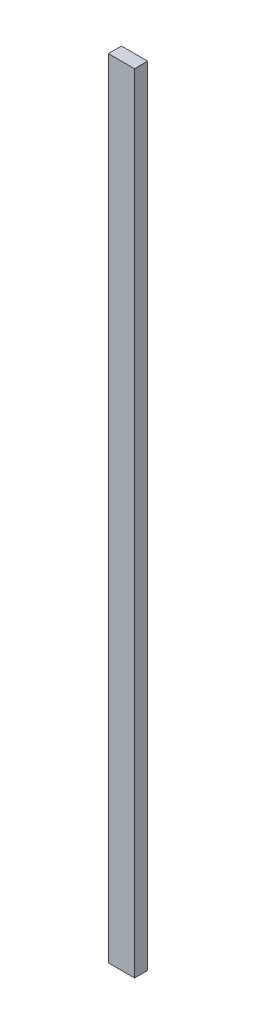
ISO-10303-21;
HEADER;
FILE_DESCRIPTION(('STEP AP214'),'2;1');
FILE_NAME('part.step','',(''),(''),'','','');
FILE_SCHEMA(('AUTOMOTIVE_DESIGN { 1 0 10303 214 1 1 1 1 }'));
ENDSEC;
DATA;
#1=APPLICATION_CONTEXT('core data for automotive mechanical design processes');
#2=APPLICATION_PROTOCOL_DEFINITION('international standard','automotive_design',2000,#1);
#3=PRODUCT_CONTEXT('',#1,'mechanical');
#4=PRODUCT('Part','Part','',(#3));
#5=PRODUCT_RELATED_PRODUCT_CATEGORY('part','',(#4));
#6=PRODUCT_DEFINITION_FORMATION('','',#4);
#7=PRODUCT_DEFINITION_CONTEXT('part definition',#1,'design');
#8=PRODUCT_DEFINITION('design','',#6,#7);
#9=PRODUCT_DEFINITION_SHAPE('','',#8);
#10=(LENGTH_UNIT() NAMED_UNIT(*) SI_UNIT(.MILLI.,.METRE.));
#11=(NAMED_UNIT(*) PLANE_ANGLE_UNIT() SI_UNIT($,.RADIAN.));
#12=(NAMED_UNIT(*) SI_UNIT($,.STERADIAN.) SOLID_ANGLE_UNIT());
#13=UNCERTAINTY_MEASURE_WITH_UNIT(LENGTH_MEASURE(1.E-05),#10,'distance_accuracy_value','');
#14=(GEOMETRIC_REPRESENTATION_CONTEXT(3) GLOBAL_UNCERTAINTY_ASSIGNED_CONTEXT((#13)) GLOBAL_UNIT_ASSIGNED_CONTEXT((#10,
#11,#12)) REPRESENTATION_CONTEXT('',''));
#15=CARTESIAN_POINT('',(0.,0.,0.));
#16=DIRECTION('',(0.,0.,1.));
#17=DIRECTION('',(1.,0.,0.));
#18=AXIS2_PLACEMENT_3D('',#15,#16,#17);
#19=CARTESIAN_POINT('',(0.,0.,10.));
#20=DIRECTION('',(1.,0.,0.));
#21=DIRECTION('',(0.,0.,-1.));
#22=AXIS2_PLACEMENT_3D('',#19,#20,#21);
#23=PLANE('',#22);
#24=DIRECTION('',(0.,-1.,0.));
#25=VECTOR('',#24,1.);
#26=CARTESIAN_POINT('',(0.,0.,0.));
#27=LINE('',#26,#25);
#28=CARTESIAN_POINT('',(0.,600.,0.));
#29=VERTEX_POINT('',#28);
#30=CARTESIAN_POINT('',(0.,0.,0.));
#31=VERTEX_POINT('',#30);
#32=EDGE_CURVE('E96',#29,#31,#27,.T.);
#33=ORIENTED_EDGE('',*,*,#32,.T.);
#34=DIRECTION('',(0.,0.,-1.));
#35=VECTOR('',#34,1.);
#36=CARTESIAN_POINT('',(0.,0.,10.));
#37=LINE('',#36,#35);
#38=CARTESIAN_POINT('',(0.,0.,10.));
#39=VERTEX_POINT('',#38);
#40=EDGE_CURVE('E11',#39,#31,#37,.T.);
#41=ORIENTED_EDGE('',*,*,#40,.F.);
#42=DIRECTION('',(0.,-1.,0.));
#43=VECTOR('',#42,1.);
#44=CARTESIAN_POINT('',(0.,0.,10.));
#45=LINE('',#44,#43);
#46=CARTESIAN_POINT('',(0.,600.,10.));
#47=VERTEX_POINT('',#46);
#48=EDGE_CURVE('E84',#47,#39,#45,.T.);
#49=ORIENTED_EDGE('',*,*,#48,.F.);
#50=DIRECTION('',(0.,0.,-1.));
#51=VECTOR('',#50,1.);
#52=CARTESIAN_POINT('',(0.,600.,10.));
#53=LINE('',#52,#51);
#54=EDGE_CURVE('E92',#47,#29,#53,.T.);
#55=ORIENTED_EDGE('',*,*,#54,.T.);
#56=EDGE_LOOP('',(#33,#41,#49,#55));
#57=FACE_BOUND('',#56,.T.);
#58=ADVANCED_FACE('F33',(#57),#23,.F.);
#59=CARTESIAN_POINT('',(0.,0.,10.));
#60=DIRECTION('',(0.,1.,0.));
#61=DIRECTION('',(0.,0.,1.));
#62=AXIS2_PLACEMENT_3D('',#59,#60,#61);
#63=PLANE('',#62);
#64=DIRECTION('',(1.,0.,0.));
#65=VECTOR('',#64,1.);
#66=CARTESIAN_POINT('',(0.,0.,0.));
#67=LINE('',#66,#65);
#68=CARTESIAN_POINT('',(20.,0.,0.));
#69=VERTEX_POINT('',#68);
#70=EDGE_CURVE('E88',#31,#69,#67,.T.);
#71=ORIENTED_EDGE('',*,*,#70,.T.);
#72=DIRECTION('',(0.,0.,-1.));
#73=VECTOR('',#72,1.);
#74=CARTESIAN_POINT('',(20.,0.,10.));
#75=LINE('',#74,#73);
#76=CARTESIAN_POINT('',(20.,0.,10.));
#77=VERTEX_POINT('',#76);
#78=EDGE_CURVE('E41',#77,#69,#75,.T.);
#79=ORIENTED_EDGE('',*,*,#78,.F.);
#80=DIRECTION('',(1.,0.,0.));
#81=VECTOR('',#80,1.);
#82=CARTESIAN_POINT('',(0.,0.,10.));
#83=LINE('',#82,#81);
#84=EDGE_CURVE('E79',#39,#77,#83,.T.);
#85=ORIENTED_EDGE('',*,*,#84,.F.);
#86=ORIENTED_EDGE('',*,*,#40,.T.);
#87=EDGE_LOOP('',(#71,#79,#85,#86));
#88=FACE_BOUND('',#87,.T.);
#89=ADVANCED_FACE('F87',(#88),#63,.F.);
#90=CARTESIAN_POINT('',(20.,0.,10.));
#91=DIRECTION('',(-1.,0.,0.));
#92=DIRECTION('',(0.,0.,1.));
#93=AXIS2_PLACEMENT_3D('',#90,#91,#92);
#94=PLANE('',#93);
#95=DIRECTION('',(0.,1.,0.));
#96=VECTOR('',#95,1.);
#97=CARTESIAN_POINT('',(20.,0.,0.));
#98=LINE('',#97,#96);
#99=CARTESIAN_POINT('',(20.,600.,0.));
#100=VERTEX_POINT('',#99);
#101=EDGE_CURVE('E66',#69,#100,#98,.T.);
#102=ORIENTED_EDGE('',*,*,#101,.T.);
#103=DIRECTION('',(0.,0.,-1.));
#104=VECTOR('',#103,1.);
#105=CARTESIAN_POINT('',(20.,600.,10.));
#106=LINE('',#105,#104);
#107=CARTESIAN_POINT('',(20.,600.,10.));
#108=VERTEX_POINT('',#107);
#109=EDGE_CURVE('E89',#108,#100,#106,.T.);
#110=ORIENTED_EDGE('',*,*,#109,.F.);
#111=DIRECTION('',(0.,1.,0.));
#112=VECTOR('',#111,1.);
#113=CARTESIAN_POINT('',(20.,0.,10.));
#114=LINE('',#113,#112);
#115=EDGE_CURVE('E82',#77,#108,#114,.T.);
#116=ORIENTED_EDGE('',*,*,#115,.F.);
#117=ORIENTED_EDGE('',*,*,#78,.T.);
#118=EDGE_LOOP('',(#102,#110,#116,#117));
#119=FACE_BOUND('',#118,.T.);
#120=ADVANCED_FACE('F90',(#119),#94,.F.);
#121=CARTESIAN_POINT('',(0.,600.,10.));
#122=DIRECTION('',(0.,-1.,0.));
#123=DIRECTION('',(0.,0.,-1.));
#124=AXIS2_PLACEMENT_3D('',#121,#122,#123);
#125=PLANE('',#124);
#126=DIRECTION('',(-1.,0.,0.));
#127=VECTOR('',#126,1.);
#128=CARTESIAN_POINT('',(0.,600.,0.));
#129=LINE('',#128,#127);
#130=EDGE_CURVE('E72',#100,#29,#129,.T.);
#131=ORIENTED_EDGE('',*,*,#130,.T.);
#132=ORIENTED_EDGE('',*,*,#54,.F.);
#133=DIRECTION('',(-1.,0.,0.));
#134=VECTOR('',#133,1.);
#135=CARTESIAN_POINT('',(0.,600.,10.));
#136=LINE('',#135,#134);
#137=EDGE_CURVE('E49',#108,#47,#136,.T.);
#138=ORIENTED_EDGE('',*,*,#137,.F.);
#139=ORIENTED_EDGE('',*,*,#109,.T.);
#140=EDGE_LOOP('',(#131,#132,#138,#139));
#141=FACE_BOUND('',#140,.T.);
#142=ADVANCED_FACE('F103',(#141),#125,.F.);
#143=CARTESIAN_POINT('',(0.,0.,10.));
#144=DIRECTION('',(0.,0.,-1.));
#145=DIRECTION('',(-1.,0.,0.));
#146=AXIS2_PLACEMENT_3D('',#143,#144,#145);
#147=PLANE('',#146);
#148=ORIENTED_EDGE('',*,*,#48,.T.);
#149=ORIENTED_EDGE('',*,*,#84,.T.);
#150=ORIENTED_EDGE('',*,*,#115,.T.);
#151=ORIENTED_EDGE('',*,*,#137,.T.);
#152=EDGE_LOOP('',(#148,#149,#150,#151));
#153=FACE_BOUND('',#152,.T.);
#154=ADVANCED_FACE('F80',(#153),#147,.F.);
#155=CARTESIAN_POINT('',(0.,0.,0.));
#156=DIRECTION('',(0.,0.,-1.));
#157=DIRECTION('',(-1.,0.,0.));
#158=AXIS2_PLACEMENT_3D('',#155,#156,#157);
#159=PLANE('',#158);
#160=ORIENTED_EDGE('',*,*,#32,.F.);
#161=ORIENTED_EDGE('',*,*,#130,.F.);
#162=ORIENTED_EDGE('',*,*,#101,.F.);
#163=ORIENTED_EDGE('',*,*,#70,.F.);
#164=EDGE_LOOP('',(#160,#161,#162,#163));
#165=FACE_BOUND('',#164,.T.);
#166=ADVANCED_FACE('F106',(#165),#159,.T.);
#167=CLOSED_SHELL('',(#58,#89,#120,#142,#154,#166));
#168=MANIFOLD_SOLID_BREP('B2',#167);
#169=ADVANCED_BREP_SHAPE_REPRESENTATION('',(#18,#168),#14);
#170=SHAPE_DEFINITION_REPRESENTATION(#9,#169);
ENDSEC;
END-ISO-10303-21;
